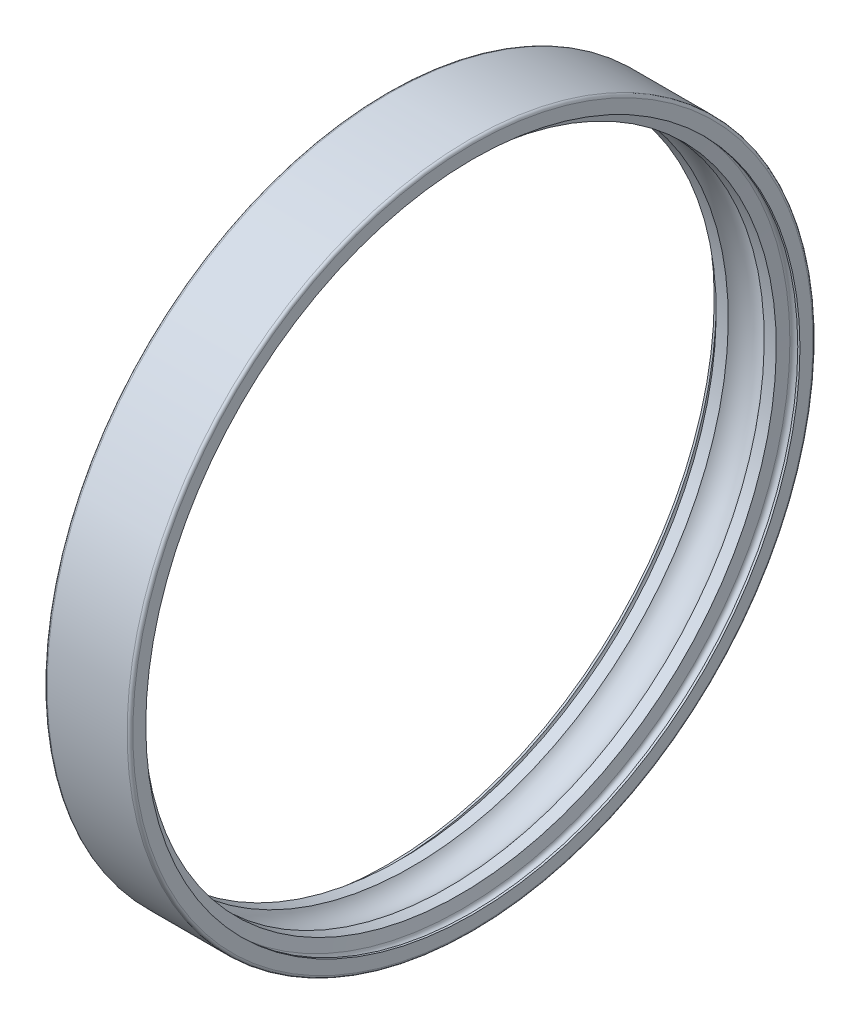
ISO-10303-21;
HEADER;
FILE_DESCRIPTION(('STEP AP214'),'2;1');
FILE_NAME('part.step','',(''),(''),'','','');
FILE_SCHEMA(('AUTOMOTIVE_DESIGN { 1 0 10303 214 1 1 1 1 }'));
ENDSEC;
DATA;
#1=APPLICATION_CONTEXT('core data for automotive mechanical design processes');
#2=APPLICATION_PROTOCOL_DEFINITION('international standard','automotive_design',2000,#1);
#3=PRODUCT_CONTEXT('',#1,'mechanical');
#4=PRODUCT('Part','Part','',(#3));
#5=PRODUCT_RELATED_PRODUCT_CATEGORY('part','',(#4));
#6=PRODUCT_DEFINITION_FORMATION('','',#4);
#7=PRODUCT_DEFINITION_CONTEXT('part definition',#1,'design');
#8=PRODUCT_DEFINITION('design','',#6,#7);
#9=PRODUCT_DEFINITION_SHAPE('','',#8);
#10=(LENGTH_UNIT() NAMED_UNIT(*) SI_UNIT(.MILLI.,.METRE.));
#11=(NAMED_UNIT(*) PLANE_ANGLE_UNIT() SI_UNIT($,.RADIAN.));
#12=(NAMED_UNIT(*) SI_UNIT($,.STERADIAN.) SOLID_ANGLE_UNIT());
#13=UNCERTAINTY_MEASURE_WITH_UNIT(LENGTH_MEASURE(1.E-05),#10,'distance_accuracy_value','');
#14=(GEOMETRIC_REPRESENTATION_CONTEXT(3) GLOBAL_UNCERTAINTY_ASSIGNED_CONTEXT((#13)) GLOBAL_UNIT_ASSIGNED_CONTEXT((#10,
#11,#12)) REPRESENTATION_CONTEXT('',''));
#15=CARTESIAN_POINT('',(0.,0.,0.));
#16=DIRECTION('',(0.,0.,1.));
#17=DIRECTION('',(1.,0.,0.));
#18=AXIS2_PLACEMENT_3D('',#15,#16,#17);
#19=CARTESIAN_POINT('',(8.316,0.,0.));
#20=DIRECTION('',(1.,0.,0.));
#21=DIRECTION('',(0.,0.,-1.));
#22=AXIS2_PLACEMENT_3D('',#19,#20,#21);
#23=TOROIDAL_SURFACE('',#22,34.34,0.456);
#24=CARTESIAN_POINT('',(8.772,0.,0.));
#25=DIRECTION('',(1.,0.,0.));
#26=DIRECTION('',(0.,1.,0.));
#27=AXIS2_PLACEMENT_3D('',#24,#25,#26);
#28=CIRCLE('',#27,34.34);
#29=CARTESIAN_POINT('',(8.772,34.34,0.));
#30=VERTEX_POINT('',#29);
#31=EDGE_CURVE('E11',#30,#30,#28,.T.);
#32=ORIENTED_EDGE('',*,*,#31,.T.);
#33=EDGE_LOOP('',(#32));
#34=FACE_BOUND('',#33,.T.);
#35=CARTESIAN_POINT('',(7.86692766462643,0.,0.));
#36=DIRECTION('',(1.,0.,0.));
#37=DIRECTION('',(0.,1.,0.));
#38=AXIS2_PLACEMENT_3D('',#35,#36,#37);
#39=CIRCLE('',#38,34.4191835690161);
#40=CARTESIAN_POINT('',(7.86692766462643,34.4191835690161,0.));
#41=VERTEX_POINT('',#40);
#42=EDGE_CURVE('E61',#41,#41,#39,.T.);
#43=ORIENTED_EDGE('',*,*,#42,.F.);
#44=EDGE_LOOP('',(#43));
#45=FACE_BOUND('',#44,.T.);
#46=ADVANCED_FACE('F16',(#34,#45),#23,.F.);
#47=CARTESIAN_POINT('',(8.886,0.,0.));
#48=DIRECTION('',(-1.,0.,0.));
#49=DIRECTION('',(0.,1.,0.));
#50=AXIS2_PLACEMENT_3D('',#47,#48,#49);
#51=CYLINDRICAL_SURFACE('',#50,34.34);
#52=CARTESIAN_POINT('',(9.,0.,0.));
#53=DIRECTION('',(1.,0.,0.));
#54=DIRECTION('',(0.,1.,0.));
#55=AXIS2_PLACEMENT_3D('',#52,#53,#54);
#56=CIRCLE('',#55,34.34);
#57=CARTESIAN_POINT('',(9.,34.34,0.));
#58=VERTEX_POINT('',#57);
#59=EDGE_CURVE('E25',#58,#58,#56,.T.);
#60=ORIENTED_EDGE('',*,*,#59,.T.);
#61=EDGE_LOOP('',(#60));
#62=FACE_BOUND('',#61,.T.);
#63=ORIENTED_EDGE('',*,*,#31,.F.);
#64=EDGE_LOOP('',(#63));
#65=FACE_BOUND('',#64,.T.);
#66=ADVANCED_FACE('F129',(#62,#65),#51,.F.);
#67=CARTESIAN_POINT('',(9.,35.02,0.));
#68=DIRECTION('',(1.,0.,0.));
#69=DIRECTION('',(0.,1.,0.));
#70=AXIS2_PLACEMENT_3D('',#67,#68,#69);
#71=PLANE('',#70);
#72=CARTESIAN_POINT('',(9.,0.,0.));
#73=DIRECTION('',(1.,0.,0.));
#74=DIRECTION('',(0.,1.,0.));
#75=AXIS2_PLACEMENT_3D('',#72,#73,#74);
#76=CIRCLE('',#75,35.7);
#77=CARTESIAN_POINT('',(9.,35.7,0.));
#78=VERTEX_POINT('',#77);
#79=EDGE_CURVE('E93',#78,#78,#76,.T.);
#80=ORIENTED_EDGE('',*,*,#79,.T.);
#81=EDGE_LOOP('',(#80));
#82=FACE_BOUND('',#81,.T.);
#83=ORIENTED_EDGE('',*,*,#59,.F.);
#84=EDGE_LOOP('',(#83));
#85=FACE_BOUND('',#84,.T.);
#86=ADVANCED_FACE('F134',(#82,#85),#71,.T.);
#87=CARTESIAN_POINT('',(8.7,0.,0.));
#88=DIRECTION('',(1.,0.,0.));
#89=DIRECTION('',(0.,0.,-1.));
#90=AXIS2_PLACEMENT_3D('',#87,#88,#89);
#91=TOROIDAL_SURFACE('',#90,35.7,0.3);
#92=CARTESIAN_POINT('',(8.7,0.,0.));
#93=DIRECTION('',(1.,0.,0.));
#94=DIRECTION('',(0.,1.,0.));
#95=AXIS2_PLACEMENT_3D('',#92,#93,#94);
#96=CIRCLE('',#95,36.);
#97=CARTESIAN_POINT('',(8.7,36.,0.));
#98=VERTEX_POINT('',#97);
#99=EDGE_CURVE('E94',#98,#98,#96,.T.);
#100=ORIENTED_EDGE('',*,*,#99,.T.);
#101=EDGE_LOOP('',(#100));
#102=FACE_BOUND('',#101,.T.);
#103=ORIENTED_EDGE('',*,*,#79,.F.);
#104=EDGE_LOOP('',(#103));
#105=FACE_BOUND('',#104,.T.);
#106=ADVANCED_FACE('F144',(#102,#105),#91,.T.);
#107=CARTESIAN_POINT('',(4.5,0.,0.));
#108=DIRECTION('',(-1.,0.,0.));
#109=DIRECTION('',(0.,1.,0.));
#110=AXIS2_PLACEMENT_3D('',#107,#108,#109);
#111=CYLINDRICAL_SURFACE('',#110,36.);
#112=CARTESIAN_POINT('',(0.3,0.,0.));
#113=DIRECTION('',(1.,0.,0.));
#114=DIRECTION('',(0.,1.,0.));
#115=AXIS2_PLACEMENT_3D('',#112,#113,#114);
#116=CIRCLE('',#115,36.);
#117=CARTESIAN_POINT('',(0.3,36.,0.));
#118=VERTEX_POINT('',#117);
#119=EDGE_CURVE('E98',#118,#118,#116,.T.);
#120=ORIENTED_EDGE('',*,*,#119,.T.);
#121=EDGE_LOOP('',(#120));
#122=FACE_BOUND('',#121,.T.);
#123=ORIENTED_EDGE('',*,*,#99,.F.);
#124=EDGE_LOOP('',(#123));
#125=FACE_BOUND('',#124,.T.);
#126=ADVANCED_FACE('F124',(#122,#125),#111,.T.);
#127=CARTESIAN_POINT('',(0.3,0.,0.));
#128=DIRECTION('',(1.,0.,0.));
#129=DIRECTION('',(0.,0.,-1.));
#130=AXIS2_PLACEMENT_3D('',#127,#128,#129);
#131=TOROIDAL_SURFACE('',#130,35.7,0.3);
#132=CARTESIAN_POINT('',(0.,0.,0.));
#133=DIRECTION('',(1.,0.,0.));
#134=DIRECTION('',(0.,1.,0.));
#135=AXIS2_PLACEMENT_3D('',#132,#133,#134);
#136=CIRCLE('',#135,35.7);
#137=CARTESIAN_POINT('',(0.,35.7,0.));
#138=VERTEX_POINT('',#137);
#139=EDGE_CURVE('E87',#138,#138,#136,.T.);
#140=ORIENTED_EDGE('',*,*,#139,.T.);
#141=EDGE_LOOP('',(#140));
#142=FACE_BOUND('',#141,.T.);
#143=ORIENTED_EDGE('',*,*,#119,.F.);
#144=EDGE_LOOP('',(#143));
#145=FACE_BOUND('',#144,.T.);
#146=ADVANCED_FACE('F108',(#142,#145),#131,.T.);
#147=CARTESIAN_POINT('',(0.,35.02,0.));
#148=DIRECTION('',(-1.,0.,0.));
#149=DIRECTION('',(0.,-1.,0.));
#150=AXIS2_PLACEMENT_3D('',#147,#148,#149);
#151=PLANE('',#150);
#152=CARTESIAN_POINT('',(0.,0.,0.));
#153=DIRECTION('',(1.,0.,0.));
#154=DIRECTION('',(0.,1.,0.));
#155=AXIS2_PLACEMENT_3D('',#152,#153,#154);
#156=CIRCLE('',#155,34.34);
#157=CARTESIAN_POINT('',(0.,34.34,0.));
#158=VERTEX_POINT('',#157);
#159=EDGE_CURVE('E90',#158,#158,#156,.T.);
#160=ORIENTED_EDGE('',*,*,#159,.T.);
#161=EDGE_LOOP('',(#160));
#162=FACE_BOUND('',#161,.T.);
#163=ORIENTED_EDGE('',*,*,#139,.F.);
#164=EDGE_LOOP('',(#163));
#165=FACE_BOUND('',#164,.T.);
#166=ADVANCED_FACE('F111',(#162,#165),#151,.T.);
#167=CARTESIAN_POINT('',(0.114,0.,0.));
#168=DIRECTION('',(-1.,0.,0.));
#169=DIRECTION('',(0.,1.,0.));
#170=AXIS2_PLACEMENT_3D('',#167,#168,#169);
#171=CYLINDRICAL_SURFACE('',#170,34.34);
#172=CARTESIAN_POINT('',(0.228,0.,0.));
#173=DIRECTION('',(1.,0.,0.));
#174=DIRECTION('',(0.,1.,0.));
#175=AXIS2_PLACEMENT_3D('',#172,#173,#174);
#176=CIRCLE('',#175,34.34);
#177=CARTESIAN_POINT('',(0.228,34.34,0.));
#178=VERTEX_POINT('',#177);
#179=EDGE_CURVE('E20',#178,#178,#176,.T.);
#180=ORIENTED_EDGE('',*,*,#179,.T.);
#181=EDGE_LOOP('',(#180));
#182=FACE_BOUND('',#181,.T.);
#183=ORIENTED_EDGE('',*,*,#159,.F.);
#184=EDGE_LOOP('',(#183));
#185=FACE_BOUND('',#184,.T.);
#186=ADVANCED_FACE('F113',(#182,#185),#171,.F.);
#187=CARTESIAN_POINT('',(0.684,0.,0.));
#188=DIRECTION('',(1.,0.,0.));
#189=DIRECTION('',(0.,0.,-1.));
#190=AXIS2_PLACEMENT_3D('',#187,#188,#189);
#191=TOROIDAL_SURFACE('',#190,34.34,0.456);
#192=CARTESIAN_POINT('',(1.13307233537357,0.,0.));
#193=DIRECTION('',(1.,0.,0.));
#194=DIRECTION('',(0.,1.,0.));
#195=AXIS2_PLACEMENT_3D('',#192,#193,#194);
#196=CIRCLE('',#195,34.4191835690161);
#197=CARTESIAN_POINT('',(1.13307233537357,34.4191835690161,0.));
#198=VERTEX_POINT('',#197);
#199=EDGE_CURVE('E80',#198,#198,#196,.T.);
#200=ORIENTED_EDGE('',*,*,#199,.T.);
#201=EDGE_LOOP('',(#200));
#202=FACE_BOUND('',#201,.T.);
#203=ORIENTED_EDGE('',*,*,#179,.F.);
#204=EDGE_LOOP('',(#203));
#205=FACE_BOUND('',#204,.T.);
#206=ADVANCED_FACE('F121',(#202,#205),#191,.F.);
#207=CARTESIAN_POINT('',(1.24055981420056,0.,0.));
#208=DIRECTION('',(-1.,0.,0.));
#209=DIRECTION('',(0.,1.,0.));
#210=AXIS2_PLACEMENT_3D('',#207,#208,#209);
#211=CONICAL_SURFACE('',#210,33.8095917845081,1.39626340159546);
#212=CARTESIAN_POINT('',(1.34804729302755,0.,0.));
#213=DIRECTION('',(1.,0.,0.));
#214=DIRECTION('',(0.,1.,0.));
#215=AXIS2_PLACEMENT_3D('',#212,#213,#214);
#216=CIRCLE('',#215,33.2);
#217=CARTESIAN_POINT('',(1.34804729302755,33.2,0.));
#218=VERTEX_POINT('',#217);
#219=EDGE_CURVE('E76',#218,#218,#216,.T.);
#220=ORIENTED_EDGE('',*,*,#219,.T.);
#221=EDGE_LOOP('',(#220));
#222=FACE_BOUND('',#221,.T.);
#223=ORIENTED_EDGE('',*,*,#199,.F.);
#224=EDGE_LOOP('',(#223));
#225=FACE_BOUND('',#224,.T.);
#226=ADVANCED_FACE('F77',(#222,#225),#211,.F.);
#227=CARTESIAN_POINT('',(1.97974336502951,0.,0.));
#228=DIRECTION('',(-1.,0.,0.));
#229=DIRECTION('',(0.,1.,0.));
#230=AXIS2_PLACEMENT_3D('',#227,#228,#229);
#231=CYLINDRICAL_SURFACE('',#230,33.2);
#232=CARTESIAN_POINT('',(2.61143943703147,0.,0.));
#233=DIRECTION('',(1.,0.,0.));
#234=DIRECTION('',(0.,1.,0.));
#235=AXIS2_PLACEMENT_3D('',#232,#233,#234);
#236=CIRCLE('',#235,33.2);
#237=CARTESIAN_POINT('',(2.61143943703147,33.2,0.));
#238=VERTEX_POINT('',#237);
#239=EDGE_CURVE('E81',#238,#238,#236,.T.);
#240=ORIENTED_EDGE('',*,*,#239,.T.);
#241=EDGE_LOOP('',(#240));
#242=FACE_BOUND('',#241,.T.);
#243=ORIENTED_EDGE('',*,*,#219,.F.);
#244=EDGE_LOOP('',(#243));
#245=FACE_BOUND('',#244,.T.);
#246=ADVANCED_FACE('F142',(#242,#245),#231,.F.);
#247=CARTESIAN_POINT('',(4.5,0.,0.));
#248=DIRECTION('',(1.,0.,0.));
#249=DIRECTION('',(0.,0.,-1.));
#250=AXIS2_PLACEMENT_3D('',#247,#248,#249);
#251=TOROIDAL_SURFACE('',#250,31.75,2.381);
#252=CARTESIAN_POINT('',(6.38856056296853,0.,0.));
#253=DIRECTION('',(1.,0.,0.));
#254=DIRECTION('',(0.,1.,0.));
#255=AXIS2_PLACEMENT_3D('',#252,#253,#254);
#256=CIRCLE('',#255,33.2);
#257=CARTESIAN_POINT('',(6.38856056296853,33.2,0.));
#258=VERTEX_POINT('',#257);
#259=EDGE_CURVE('E84',#258,#258,#256,.T.);
#260=ORIENTED_EDGE('',*,*,#259,.T.);
#261=EDGE_LOOP('',(#260));
#262=FACE_BOUND('',#261,.T.);
#263=ORIENTED_EDGE('',*,*,#239,.F.);
#264=EDGE_LOOP('',(#263));
#265=FACE_BOUND('',#264,.T.);
#266=ADVANCED_FACE('F139',(#262,#265),#251,.F.);
#267=CARTESIAN_POINT('',(7.02025663497049,0.,0.));
#268=DIRECTION('',(-1.,0.,0.));
#269=DIRECTION('',(0.,1.,0.));
#270=AXIS2_PLACEMENT_3D('',#267,#268,#269);
#271=CYLINDRICAL_SURFACE('',#270,33.2);
#272=CARTESIAN_POINT('',(7.65195270697245,0.,0.));
#273=DIRECTION('',(1.,0.,0.));
#274=DIRECTION('',(0.,1.,0.));
#275=AXIS2_PLACEMENT_3D('',#272,#273,#274);
#276=CIRCLE('',#275,33.2);
#277=CARTESIAN_POINT('',(7.65195270697245,33.2,0.));
#278=VERTEX_POINT('',#277);
#279=EDGE_CURVE('E56',#278,#278,#276,.T.);
#280=ORIENTED_EDGE('',*,*,#279,.T.);
#281=EDGE_LOOP('',(#280));
#282=FACE_BOUND('',#281,.T.);
#283=ORIENTED_EDGE('',*,*,#259,.F.);
#284=EDGE_LOOP('',(#283));
#285=FACE_BOUND('',#284,.T.);
#286=ADVANCED_FACE('F18',(#282,#285),#271,.F.);
#287=CARTESIAN_POINT('',(7.75944018579944,0.,0.));
#288=DIRECTION('',(1.,0.,0.));
#289=DIRECTION('',(0.,1.,0.));
#290=AXIS2_PLACEMENT_3D('',#287,#288,#289);
#291=CONICAL_SURFACE('',#290,33.8095917845081,1.39626340159546);
#292=ORIENTED_EDGE('',*,*,#42,.T.);
#293=EDGE_LOOP('',(#292));
#294=FACE_BOUND('',#293,.T.);
#295=ORIENTED_EDGE('',*,*,#279,.F.);
#296=EDGE_LOOP('',(#295));
#297=FACE_BOUND('',#296,.T.);
#298=ADVANCED_FACE('F224',(#294,#297),#291,.F.);
#299=CLOSED_SHELL('',(#46,#66,#86,#106,#126,#146,#166,#186,#206,#226,#246,#266,#286,#298));
#300=MANIFOLD_SOLID_BREP('B1',#299);
#301=ADVANCED_BREP_SHAPE_REPRESENTATION('',(#18,#300),#14);
#302=SHAPE_DEFINITION_REPRESENTATION(#9,#301);
ENDSEC;
END-ISO-10303-21;
